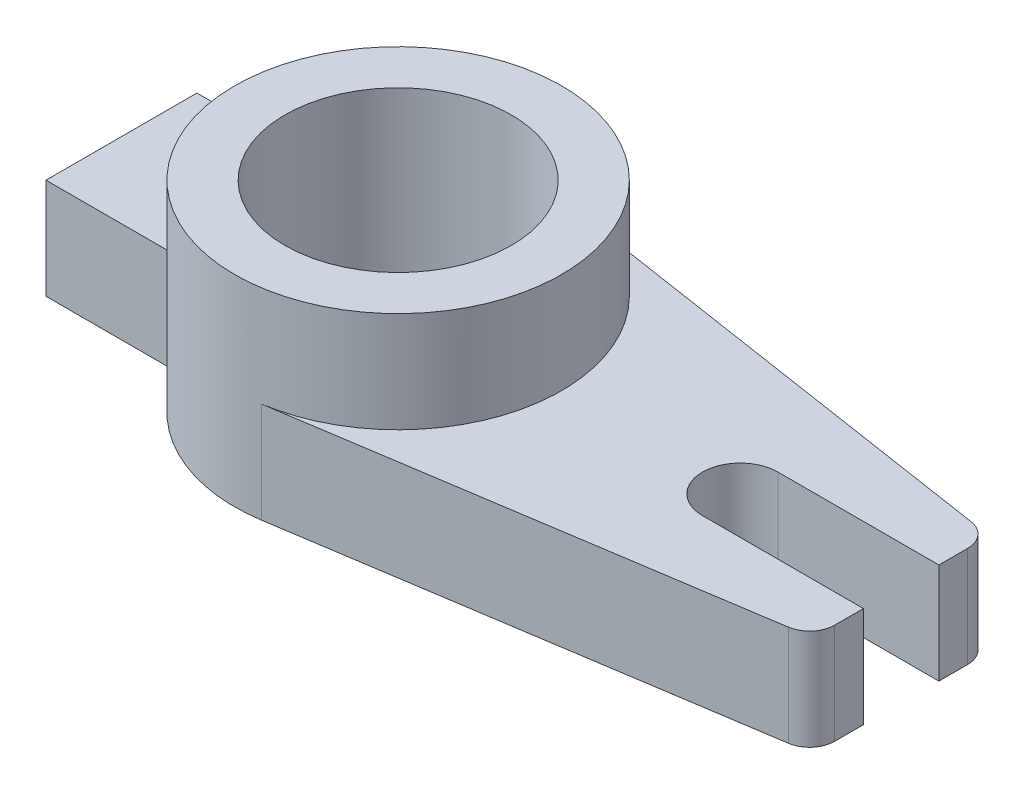
ISO-10303-21;
HEADER;
FILE_DESCRIPTION(('STEP AP214'),'2;1');
FILE_NAME('part.step','',(''),(''),'','','');
FILE_SCHEMA(('AUTOMOTIVE_DESIGN { 1 0 10303 214 1 1 1 1 }'));
ENDSEC;
DATA;
#1=APPLICATION_CONTEXT('core data for automotive mechanical design processes');
#2=APPLICATION_PROTOCOL_DEFINITION('international standard','automotive_design',2000,#1);
#3=PRODUCT_CONTEXT('',#1,'mechanical');
#4=PRODUCT('Part','Part','',(#3));
#5=PRODUCT_RELATED_PRODUCT_CATEGORY('part','',(#4));
#6=PRODUCT_DEFINITION_FORMATION('','',#4);
#7=PRODUCT_DEFINITION_CONTEXT('part definition',#1,'design');
#8=PRODUCT_DEFINITION('design','',#6,#7);
#9=PRODUCT_DEFINITION_SHAPE('','',#8);
#10=(LENGTH_UNIT() NAMED_UNIT(*) SI_UNIT(.MILLI.,.METRE.));
#11=(NAMED_UNIT(*) PLANE_ANGLE_UNIT() SI_UNIT($,.RADIAN.));
#12=(NAMED_UNIT(*) SI_UNIT($,.STERADIAN.) SOLID_ANGLE_UNIT());
#13=UNCERTAINTY_MEASURE_WITH_UNIT(LENGTH_MEASURE(1.E-05),#10,'distance_accuracy_value','');
#14=(GEOMETRIC_REPRESENTATION_CONTEXT(3) GLOBAL_UNCERTAINTY_ASSIGNED_CONTEXT((#13)) GLOBAL_UNIT_ASSIGNED_CONTEXT((#10,
#11,#12)) REPRESENTATION_CONTEXT('',''));
#15=CARTESIAN_POINT('',(0.,0.,0.));
#16=DIRECTION('',(0.,0.,1.));
#17=DIRECTION('',(1.,0.,0.));
#18=AXIS2_PLACEMENT_3D('',#15,#16,#17);
#19=CARTESIAN_POINT('',(0.,40.,0.));
#20=DIRECTION('',(0.,-1.,0.));
#21=DIRECTION('',(0.,0.,-1.));
#22=AXIS2_PLACEMENT_3D('',#19,#20,#21);
#23=CYLINDRICAL_SURFACE('',#22,32.5);
#24=CARTESIAN_POINT('',(0.,40.,0.));
#25=DIRECTION('',(0.,1.,0.));
#26=DIRECTION('',(0.,0.,1.));
#27=AXIS2_PLACEMENT_3D('',#24,#25,#26);
#28=CIRCLE('',#27,32.5);
#29=CARTESIAN_POINT('',(0.,40.,32.5));
#30=VERTEX_POINT('',#29);
#31=EDGE_CURVE('E163',#30,#30,#28,.T.);
#32=ORIENTED_EDGE('',*,*,#31,.F.);
#33=EDGE_LOOP('',(#32));
#34=FACE_BOUND('',#33,.T.);
#35=DIRECTION('',(0.,-1.,0.));
#36=VECTOR('',#35,1.);
#37=CARTESIAN_POINT('',(-28.831406486677,20.,-15.));
#38=LINE('',#37,#36);
#39=CARTESIAN_POINT('',(-28.831406486677,20.,-15.));
#40=VERTEX_POINT('',#39);
#41=CARTESIAN_POINT('',(-28.831406486677,0.,-15.));
#42=VERTEX_POINT('',#41);
#43=EDGE_CURVE('E259',#40,#42,#38,.T.);
#44=ORIENTED_EDGE('',*,*,#43,.F.);
#45=CARTESIAN_POINT('',(0.,20.,0.));
#46=DIRECTION('',(0.,1.,0.));
#47=DIRECTION('',(0.,0.,1.));
#48=AXIS2_PLACEMENT_3D('',#45,#46,#47);
#49=CIRCLE('',#48,32.5);
#50=CARTESIAN_POINT('',(-28.831406486677,20.,15.));
#51=VERTEX_POINT('',#50);
#52=EDGE_CURVE('E264',#40,#51,#49,.T.);
#53=ORIENTED_EDGE('',*,*,#52,.T.);
#54=DIRECTION('',(0.,-1.,0.));
#55=VECTOR('',#54,1.);
#56=CARTESIAN_POINT('',(-28.831406486677,20.,15.));
#57=LINE('',#56,#55);
#58=CARTESIAN_POINT('',(-28.831406486677,0.,15.));
#59=VERTEX_POINT('',#58);
#60=EDGE_CURVE('E289',#51,#59,#57,.T.);
#61=ORIENTED_EDGE('',*,*,#60,.T.);
#62=CARTESIAN_POINT('',(0.,0.,0.));
#63=DIRECTION('',(0.,1.,0.));
#64=DIRECTION('',(0.,0.,1.));
#65=AXIS2_PLACEMENT_3D('',#62,#63,#64);
#66=CIRCLE('',#65,32.5);
#67=CARTESIAN_POINT('',(4.94111598055763,0.,32.1221943968135));
#68=VERTEX_POINT('',#67);
#69=EDGE_CURVE('E276',#59,#68,#66,.T.);
#70=ORIENTED_EDGE('',*,*,#69,.T.);
#71=DIRECTION('',(0.,-1.,0.));
#72=VECTOR('',#71,1.);
#73=CARTESIAN_POINT('',(4.94111598055763,20.,32.1221943968135));
#74=LINE('',#73,#72);
#75=CARTESIAN_POINT('',(4.94111598055763,20.,32.1221943968135));
#76=VERTEX_POINT('',#75);
#77=EDGE_CURVE('E11',#76,#68,#74,.T.);
#78=ORIENTED_EDGE('',*,*,#77,.F.);
#79=CARTESIAN_POINT('',(0.,20.,0.));
#80=DIRECTION('',(0.,1.,0.));
#81=DIRECTION('',(0.,0.,1.));
#82=AXIS2_PLACEMENT_3D('',#79,#80,#81);
#83=CIRCLE('',#82,32.5);
#84=CARTESIAN_POINT('',(4.94111598055763,20.,-32.1221943968135));
#85=VERTEX_POINT('',#84);
#86=EDGE_CURVE('E182',#76,#85,#83,.T.);
#87=ORIENTED_EDGE('',*,*,#86,.T.);
#88=DIRECTION('',(0.,-1.,0.));
#89=VECTOR('',#88,1.);
#90=CARTESIAN_POINT('',(4.94111598055763,20.,-32.1221943968135));
#91=LINE('',#90,#89);
#92=CARTESIAN_POINT('',(4.94111598055763,0.,-32.1221943968135));
#93=VERTEX_POINT('',#92);
#94=EDGE_CURVE('E158',#85,#93,#91,.T.);
#95=ORIENTED_EDGE('',*,*,#94,.T.);
#96=EDGE_CURVE('E275',#93,#42,#66,.T.);
#97=ORIENTED_EDGE('',*,*,#96,.T.);
#98=EDGE_LOOP('',(#44,#53,#61,#70,#78,#87,#95,#97));
#99=FACE_BOUND('',#98,.T.);
#100=ADVANCED_FACE('F39',(#34,#99),#23,.T.);
#101=CARTESIAN_POINT('',(4.94111598055764,20.,32.1221943968135));
#102=DIRECTION('',(-0.152034337863312,0.,-0.988375212209647));
#103=DIRECTION('',(-0.988375212209647,0.,0.152034337863312));
#104=AXIS2_PLACEMENT_3D('',#101,#102,#103);
#105=PLANE('',#104);
#106=DIRECTION('',(0.988375212209647,0.,-0.152034337863312));
#107=VECTOR('',#106,1.);
#108=CARTESIAN_POINT('',(4.94111598055764,0.,32.1221943968135));
#109=LINE('',#108,#107);
#110=CARTESIAN_POINT('',(95.7601716893165,0.,18.1521809550725));
#111=VERTEX_POINT('',#110);
#112=EDGE_CURVE('E162',#68,#111,#109,.T.);
#113=ORIENTED_EDGE('',*,*,#112,.T.);
#114=DIRECTION('',(0.,-1.,0.));
#115=VECTOR('',#114,1.);
#116=CARTESIAN_POINT('',(95.7601716893165,20.,18.1521809550725));
#117=LINE('',#116,#115);
#118=CARTESIAN_POINT('',(95.7601716893165,20.,18.1521809550725));
#119=VERTEX_POINT('',#118);
#120=EDGE_CURVE('E50',#119,#111,#117,.T.);
#121=ORIENTED_EDGE('',*,*,#120,.F.);
#122=DIRECTION('',(0.988375212209647,0.,-0.152034337863312));
#123=VECTOR('',#122,1.);
#124=CARTESIAN_POINT('',(4.94111598055764,20.,32.1221943968135));
#125=LINE('',#124,#123);
#126=EDGE_CURVE('E108',#76,#119,#125,.T.);
#127=ORIENTED_EDGE('',*,*,#126,.F.);
#128=ORIENTED_EDGE('',*,*,#77,.T.);
#129=EDGE_LOOP('',(#113,#121,#127,#128));
#130=FACE_BOUND('',#129,.T.);
#131=ADVANCED_FACE('F41',(#130),#105,.F.);
#132=CARTESIAN_POINT('',(95.,20.,13.2103048940243));
#133=DIRECTION('',(0.,-1.,0.));
#134=DIRECTION('',(0.,0.,-1.));
#135=AXIS2_PLACEMENT_3D('',#132,#133,#134);
#136=CYLINDRICAL_SURFACE('',#135,5.);
#137=CARTESIAN_POINT('',(95.,0.,13.2103048940243));
#138=DIRECTION('',(0.,1.,0.));
#139=DIRECTION('',(0.,0.,1.));
#140=AXIS2_PLACEMENT_3D('',#137,#138,#139);
#141=CIRCLE('',#140,5.);
#142=CARTESIAN_POINT('',(100.,0.,13.2103048940242));
#143=VERTEX_POINT('',#142);
#144=EDGE_CURVE('E161',#143,#111,#141,.F.);
#145=ORIENTED_EDGE('',*,*,#144,.F.);
#146=DIRECTION('',(0.,-1.,0.));
#147=VECTOR('',#146,1.);
#148=CARTESIAN_POINT('',(100.,20.,13.2103048940242));
#149=LINE('',#148,#147);
#150=CARTESIAN_POINT('',(100.,20.,13.2103048940242));
#151=VERTEX_POINT('',#150);
#152=EDGE_CURVE('E191',#151,#143,#149,.T.);
#153=ORIENTED_EDGE('',*,*,#152,.F.);
#154=CARTESIAN_POINT('',(95.,20.,13.2103048940243));
#155=DIRECTION('',(0.,1.,0.));
#156=DIRECTION('',(0.,0.,1.));
#157=AXIS2_PLACEMENT_3D('',#154,#155,#156);
#158=CIRCLE('',#157,5.);
#159=EDGE_CURVE('E198',#151,#119,#158,.F.);
#160=ORIENTED_EDGE('',*,*,#159,.T.);
#161=ORIENTED_EDGE('',*,*,#120,.T.);
#162=EDGE_LOOP('',(#145,#153,#160,#161));
#163=FACE_BOUND('',#162,.T.);
#164=ADVANCED_FACE('F200',(#163),#136,.T.);
#165=CARTESIAN_POINT('',(100.,20.,0.));
#166=DIRECTION('',(1.,0.,0.));
#167=DIRECTION('',(0.,0.,-1.));
#168=AXIS2_PLACEMENT_3D('',#165,#166,#167);
#169=PLANE('',#168);
#170=DIRECTION('',(0.,0.,1.));
#171=VECTOR('',#170,1.);
#172=CARTESIAN_POINT('',(100.,0.,0.));
#173=LINE('',#172,#171);
#174=CARTESIAN_POINT('',(100.,0.,7.5));
#175=VERTEX_POINT('',#174);
#176=EDGE_CURVE('E166',#175,#143,#173,.T.);
#177=ORIENTED_EDGE('',*,*,#176,.F.);
#178=DIRECTION('',(0.,-1.,0.));
#179=VECTOR('',#178,1.);
#180=CARTESIAN_POINT('',(100.,20.,7.5));
#181=LINE('',#180,#179);
#182=CARTESIAN_POINT('',(100.,20.,7.5));
#183=VERTEX_POINT('',#182);
#184=EDGE_CURVE('E195',#183,#175,#181,.T.);
#185=ORIENTED_EDGE('',*,*,#184,.F.);
#186=DIRECTION('',(0.,0.,1.));
#187=VECTOR('',#186,1.);
#188=CARTESIAN_POINT('',(100.,20.,0.));
#189=LINE('',#188,#187);
#190=EDGE_CURVE('E211',#183,#151,#189,.T.);
#191=ORIENTED_EDGE('',*,*,#190,.T.);
#192=ORIENTED_EDGE('',*,*,#152,.T.);
#193=EDGE_LOOP('',(#177,#185,#191,#192));
#194=FACE_BOUND('',#193,.T.);
#195=ADVANCED_FACE('F208',(#194),#169,.T.);
#196=CARTESIAN_POINT('',(0.,20.,7.5));
#197=DIRECTION('',(0.,0.,-1.));
#198=DIRECTION('',(-1.,0.,0.));
#199=AXIS2_PLACEMENT_3D('',#196,#197,#198);
#200=PLANE('',#199);
#201=DIRECTION('',(1.,0.,0.));
#202=VECTOR('',#201,1.);
#203=CARTESIAN_POINT('',(0.,0.,7.5));
#204=LINE('',#203,#202);
#205=CARTESIAN_POINT('',(68.,0.,7.5));
#206=VERTEX_POINT('',#205);
#207=EDGE_CURVE('E173',#206,#175,#204,.T.);
#208=ORIENTED_EDGE('',*,*,#207,.F.);
#209=DIRECTION('',(0.,-1.,0.));
#210=VECTOR('',#209,1.);
#211=CARTESIAN_POINT('',(68.,20.,7.5));
#212=LINE('',#211,#210);
#213=CARTESIAN_POINT('',(68.,20.,7.5));
#214=VERTEX_POINT('',#213);
#215=EDGE_CURVE('E189',#214,#206,#212,.T.);
#216=ORIENTED_EDGE('',*,*,#215,.F.);
#217=DIRECTION('',(1.,0.,0.));
#218=VECTOR('',#217,1.);
#219=CARTESIAN_POINT('',(0.,20.,7.5));
#220=LINE('',#219,#218);
#221=EDGE_CURVE('E218',#214,#183,#220,.T.);
#222=ORIENTED_EDGE('',*,*,#221,.T.);
#223=ORIENTED_EDGE('',*,*,#184,.T.);
#224=EDGE_LOOP('',(#208,#216,#222,#223));
#225=FACE_BOUND('',#224,.T.);
#226=ADVANCED_FACE('F340',(#225),#200,.T.);
#227=CARTESIAN_POINT('',(68.,20.,0.));
#228=DIRECTION('',(0.,-1.,0.));
#229=DIRECTION('',(0.,0.,-1.));
#230=AXIS2_PLACEMENT_3D('',#227,#228,#229);
#231=CYLINDRICAL_SURFACE('',#230,7.50000000000001);
#232=CARTESIAN_POINT('',(68.,0.,0.));
#233=DIRECTION('',(0.,1.,0.));
#234=DIRECTION('',(0.,0.,1.));
#235=AXIS2_PLACEMENT_3D('',#232,#233,#234);
#236=CIRCLE('',#235,7.50000000000001);
#237=CARTESIAN_POINT('',(68.,0.,-7.5));
#238=VERTEX_POINT('',#237);
#239=EDGE_CURVE('E174',#238,#206,#236,.T.);
#240=ORIENTED_EDGE('',*,*,#239,.F.);
#241=DIRECTION('',(0.,-1.,0.));
#242=VECTOR('',#241,1.);
#243=CARTESIAN_POINT('',(68.,20.,-7.5));
#244=LINE('',#243,#242);
#245=CARTESIAN_POINT('',(68.,20.,-7.5));
#246=VERTEX_POINT('',#245);
#247=EDGE_CURVE('E149',#246,#238,#244,.T.);
#248=ORIENTED_EDGE('',*,*,#247,.F.);
#249=CARTESIAN_POINT('',(68.,20.,0.));
#250=DIRECTION('',(0.,1.,0.));
#251=DIRECTION('',(0.,0.,1.));
#252=AXIS2_PLACEMENT_3D('',#249,#250,#251);
#253=CIRCLE('',#252,7.50000000000001);
#254=EDGE_CURVE('E138',#246,#214,#253,.T.);
#255=ORIENTED_EDGE('',*,*,#254,.T.);
#256=ORIENTED_EDGE('',*,*,#215,.T.);
#257=EDGE_LOOP('',(#240,#248,#255,#256));
#258=FACE_BOUND('',#257,.T.);
#259=ADVANCED_FACE('F223',(#258),#231,.F.);
#260=CARTESIAN_POINT('',(0.,20.,-7.5));
#261=DIRECTION('',(0.,0.,-1.));
#262=DIRECTION('',(-1.,0.,0.));
#263=AXIS2_PLACEMENT_3D('',#260,#261,#262);
#264=PLANE('',#263);
#265=DIRECTION('',(1.,0.,0.));
#266=VECTOR('',#265,1.);
#267=CARTESIAN_POINT('',(0.,0.,-7.5));
#268=LINE('',#267,#266);
#269=CARTESIAN_POINT('',(100.,0.,-7.5));
#270=VERTEX_POINT('',#269);
#271=EDGE_CURVE('E144',#238,#270,#268,.T.);
#272=ORIENTED_EDGE('',*,*,#271,.T.);
#273=DIRECTION('',(0.,-1.,0.));
#274=VECTOR('',#273,1.);
#275=CARTESIAN_POINT('',(100.,20.,-7.5));
#276=LINE('',#275,#274);
#277=CARTESIAN_POINT('',(100.,20.,-7.5));
#278=VERTEX_POINT('',#277);
#279=EDGE_CURVE('E145',#278,#270,#276,.T.);
#280=ORIENTED_EDGE('',*,*,#279,.F.);
#281=DIRECTION('',(1.,0.,0.));
#282=VECTOR('',#281,1.);
#283=CARTESIAN_POINT('',(0.,20.,-7.5));
#284=LINE('',#283,#282);
#285=EDGE_CURVE('E127',#246,#278,#284,.T.);
#286=ORIENTED_EDGE('',*,*,#285,.F.);
#287=ORIENTED_EDGE('',*,*,#247,.T.);
#288=EDGE_LOOP('',(#272,#280,#286,#287));
#289=FACE_BOUND('',#288,.T.);
#290=ADVANCED_FACE('F142',(#289),#264,.F.);
#291=CARTESIAN_POINT('',(100.,20.,0.));
#292=DIRECTION('',(-1.,0.,0.));
#293=DIRECTION('',(0.,0.,1.));
#294=AXIS2_PLACEMENT_3D('',#291,#292,#293);
#295=PLANE('',#294);
#296=DIRECTION('',(0.,0.,-1.));
#297=VECTOR('',#296,1.);
#298=CARTESIAN_POINT('',(100.,0.,0.));
#299=LINE('',#298,#297);
#300=CARTESIAN_POINT('',(100.,0.,-13.2103048940242));
#301=VERTEX_POINT('',#300);
#302=EDGE_CURVE('E178',#270,#301,#299,.T.);
#303=ORIENTED_EDGE('',*,*,#302,.T.);
#304=DIRECTION('',(0.,-1.,0.));
#305=VECTOR('',#304,1.);
#306=CARTESIAN_POINT('',(100.,20.,-13.2103048940242));
#307=LINE('',#306,#305);
#308=CARTESIAN_POINT('',(100.,20.,-13.2103048940242));
#309=VERTEX_POINT('',#308);
#310=EDGE_CURVE('E146',#309,#301,#307,.T.);
#311=ORIENTED_EDGE('',*,*,#310,.F.);
#312=DIRECTION('',(0.,0.,-1.));
#313=VECTOR('',#312,1.);
#314=CARTESIAN_POINT('',(100.,20.,0.));
#315=LINE('',#314,#313);
#316=EDGE_CURVE('E132',#278,#309,#315,.T.);
#317=ORIENTED_EDGE('',*,*,#316,.F.);
#318=ORIENTED_EDGE('',*,*,#279,.T.);
#319=EDGE_LOOP('',(#303,#311,#317,#318));
#320=FACE_BOUND('',#319,.T.);
#321=ADVANCED_FACE('F152',(#320),#295,.F.);
#322=CARTESIAN_POINT('',(95.,20.,-13.2103048940243));
#323=DIRECTION('',(0.,-1.,0.));
#324=DIRECTION('',(0.,0.,-1.));
#325=AXIS2_PLACEMENT_3D('',#322,#323,#324);
#326=CYLINDRICAL_SURFACE('',#325,5.);
#327=CARTESIAN_POINT('',(95.,0.,-13.2103048940243));
#328=DIRECTION('',(0.,1.,0.));
#329=DIRECTION('',(0.,0.,1.));
#330=AXIS2_PLACEMENT_3D('',#327,#328,#329);
#331=CIRCLE('',#330,5.);
#332=CARTESIAN_POINT('',(95.7601716893165,0.,-18.1521809550725));
#333=VERTEX_POINT('',#332);
#334=EDGE_CURVE('E179',#301,#333,#331,.T.);
#335=ORIENTED_EDGE('',*,*,#334,.T.);
#336=DIRECTION('',(0.,-1.,0.));
#337=VECTOR('',#336,1.);
#338=CARTESIAN_POINT('',(95.7601716893165,20.,-18.1521809550725));
#339=LINE('',#338,#337);
#340=CARTESIAN_POINT('',(95.7601716893165,20.,-18.1521809550725));
#341=VERTEX_POINT('',#340);
#342=EDGE_CURVE('E186',#341,#333,#339,.T.);
#343=ORIENTED_EDGE('',*,*,#342,.F.);
#344=CARTESIAN_POINT('',(95.,20.,-13.2103048940243));
#345=DIRECTION('',(0.,1.,0.));
#346=DIRECTION('',(0.,0.,1.));
#347=AXIS2_PLACEMENT_3D('',#344,#345,#346);
#348=CIRCLE('',#347,5.);
#349=EDGE_CURVE('E65',#309,#341,#348,.T.);
#350=ORIENTED_EDGE('',*,*,#349,.F.);
#351=ORIENTED_EDGE('',*,*,#310,.T.);
#352=EDGE_LOOP('',(#335,#343,#350,#351));
#353=FACE_BOUND('',#352,.T.);
#354=ADVANCED_FACE('F226',(#353),#326,.T.);
#355=CARTESIAN_POINT('',(4.94111598055764,20.,-32.1221943968135));
#356=DIRECTION('',(0.152034337863312,0.,-0.988375212209647));
#357=DIRECTION('',(-0.988375212209647,0.,-0.152034337863312));
#358=AXIS2_PLACEMENT_3D('',#355,#356,#357);
#359=PLANE('',#358);
#360=DIRECTION('',(0.988375212209647,0.,0.152034337863312));
#361=VECTOR('',#360,1.);
#362=CARTESIAN_POINT('',(4.94111598055764,0.,-32.1221943968135));
#363=LINE('',#362,#361);
#364=EDGE_CURVE('E105',#93,#333,#363,.T.);
#365=ORIENTED_EDGE('',*,*,#364,.F.);
#366=ORIENTED_EDGE('',*,*,#94,.F.);
#367=DIRECTION('',(0.988375212209647,0.,0.152034337863312));
#368=VECTOR('',#367,1.);
#369=CARTESIAN_POINT('',(4.94111598055764,20.,-32.1221943968135));
#370=LINE('',#369,#368);
#371=EDGE_CURVE('E151',#85,#341,#370,.T.);
#372=ORIENTED_EDGE('',*,*,#371,.T.);
#373=ORIENTED_EDGE('',*,*,#342,.T.);
#374=EDGE_LOOP('',(#365,#366,#372,#373));
#375=FACE_BOUND('',#374,.T.);
#376=ADVANCED_FACE('F230',(#375),#359,.T.);
#377=CARTESIAN_POINT('',(0.,20.,0.));
#378=DIRECTION('',(0.,1.,0.));
#379=DIRECTION('',(0.,0.,1.));
#380=AXIS2_PLACEMENT_3D('',#377,#378,#379);
#381=PLANE('',#380);
#382=ORIENTED_EDGE('',*,*,#86,.F.);
#383=ORIENTED_EDGE('',*,*,#126,.T.);
#384=ORIENTED_EDGE('',*,*,#159,.F.);
#385=ORIENTED_EDGE('',*,*,#190,.F.);
#386=ORIENTED_EDGE('',*,*,#221,.F.);
#387=ORIENTED_EDGE('',*,*,#254,.F.);
#388=ORIENTED_EDGE('',*,*,#285,.T.);
#389=ORIENTED_EDGE('',*,*,#316,.T.);
#390=ORIENTED_EDGE('',*,*,#349,.T.);
#391=ORIENTED_EDGE('',*,*,#371,.F.);
#392=EDGE_LOOP('',(#382,#383,#384,#385,#386,#387,#388,#389,#390,#391));
#393=FACE_BOUND('',#392,.T.);
#394=ADVANCED_FACE('F135',(#393),#381,.T.);
#395=CARTESIAN_POINT('',(0.,0.,0.));
#396=DIRECTION('',(0.,1.,0.));
#397=DIRECTION('',(0.,0.,1.));
#398=AXIS2_PLACEMENT_3D('',#395,#396,#397);
#399=PLANE('',#398);
#400=ORIENTED_EDGE('',*,*,#112,.F.);
#401=ORIENTED_EDGE('',*,*,#69,.F.);
#402=DIRECTION('',(-1.,0.,0.));
#403=VECTOR('',#402,1.);
#404=CARTESIAN_POINT('',(0.,0.,15.));
#405=LINE('',#404,#403);
#406=CARTESIAN_POINT('',(-55.,0.,15.));
#407=VERTEX_POINT('',#406);
#408=EDGE_CURVE('E254',#59,#407,#405,.T.);
#409=ORIENTED_EDGE('',*,*,#408,.T.);
#410=DIRECTION('',(0.,0.,1.));
#411=VECTOR('',#410,1.);
#412=CARTESIAN_POINT('',(-55.,0.,0.));
#413=LINE('',#412,#411);
#414=CARTESIAN_POINT('',(-55.,0.,-15.));
#415=VERTEX_POINT('',#414);
#416=EDGE_CURVE('E288',#415,#407,#413,.T.);
#417=ORIENTED_EDGE('',*,*,#416,.F.);
#418=DIRECTION('',(-1.,0.,0.));
#419=VECTOR('',#418,1.);
#420=CARTESIAN_POINT('',(0.,0.,-15.));
#421=LINE('',#420,#419);
#422=EDGE_CURVE('E295',#42,#415,#421,.T.);
#423=ORIENTED_EDGE('',*,*,#422,.F.);
#424=ORIENTED_EDGE('',*,*,#96,.F.);
#425=ORIENTED_EDGE('',*,*,#364,.T.);
#426=ORIENTED_EDGE('',*,*,#334,.F.);
#427=ORIENTED_EDGE('',*,*,#302,.F.);
#428=ORIENTED_EDGE('',*,*,#271,.F.);
#429=ORIENTED_EDGE('',*,*,#239,.T.);
#430=ORIENTED_EDGE('',*,*,#207,.T.);
#431=ORIENTED_EDGE('',*,*,#176,.T.);
#432=ORIENTED_EDGE('',*,*,#144,.T.);
#433=EDGE_LOOP('',(#400,#401,#409,#417,#423,#424,#425,#426,#427,#428,#429,#430,#431,#432));
#434=FACE_BOUND('',#433,.T.);
#435=CARTESIAN_POINT('',(0.,0.,0.));
#436=DIRECTION('',(0.,1.,0.));
#437=DIRECTION('',(0.,0.,1.));
#438=AXIS2_PLACEMENT_3D('',#435,#436,#437);
#439=CIRCLE('',#438,22.5);
#440=CARTESIAN_POINT('',(0.,0.,22.5));
#441=VERTEX_POINT('',#440);
#442=EDGE_CURVE('E273',#441,#441,#439,.T.);
#443=ORIENTED_EDGE('',*,*,#442,.T.);
#444=EDGE_LOOP('',(#443));
#445=FACE_BOUND('',#444,.T.);
#446=ADVANCED_FACE('F203',(#434,#445),#399,.F.);
#447=CARTESIAN_POINT('',(0.,40.,0.));
#448=DIRECTION('',(0.,-1.,0.));
#449=DIRECTION('',(0.,0.,-1.));
#450=AXIS2_PLACEMENT_3D('',#447,#448,#449);
#451=CYLINDRICAL_SURFACE('',#450,22.5);
#452=CARTESIAN_POINT('',(0.,40.,0.));
#453=DIRECTION('',(0.,1.,0.));
#454=DIRECTION('',(0.,0.,1.));
#455=AXIS2_PLACEMENT_3D('',#452,#453,#454);
#456=CIRCLE('',#455,22.5);
#457=CARTESIAN_POINT('',(0.,40.,22.5));
#458=VERTEX_POINT('',#457);
#459=EDGE_CURVE('E285',#458,#458,#456,.T.);
#460=ORIENTED_EDGE('',*,*,#459,.T.);
#461=EDGE_LOOP('',(#460));
#462=FACE_BOUND('',#461,.T.);
#463=ORIENTED_EDGE('',*,*,#442,.F.);
#464=EDGE_LOOP('',(#463));
#465=FACE_BOUND('',#464,.T.);
#466=ADVANCED_FACE('F319',(#462,#465),#451,.F.);
#467=CARTESIAN_POINT('',(0.,40.,0.));
#468=DIRECTION('',(0.,1.,0.));
#469=DIRECTION('',(0.,0.,1.));
#470=AXIS2_PLACEMENT_3D('',#467,#468,#469);
#471=PLANE('',#470);
#472=ORIENTED_EDGE('',*,*,#459,.F.);
#473=EDGE_LOOP('',(#472));
#474=FACE_BOUND('',#473,.T.);
#475=ORIENTED_EDGE('',*,*,#31,.T.);
#476=EDGE_LOOP('',(#475));
#477=FACE_BOUND('',#476,.T.);
#478=ADVANCED_FACE('F306',(#474,#477),#471,.T.);
#479=CARTESIAN_POINT('',(0.,20.,-15.));
#480=DIRECTION('',(0.,0.,1.));
#481=DIRECTION('',(1.,0.,0.));
#482=AXIS2_PLACEMENT_3D('',#479,#480,#481);
#483=PLANE('',#482);
#484=ORIENTED_EDGE('',*,*,#422,.T.);
#485=DIRECTION('',(0.,-1.,0.));
#486=VECTOR('',#485,1.);
#487=CARTESIAN_POINT('',(-55.,20.,-15.));
#488=LINE('',#487,#486);
#489=CARTESIAN_POINT('',(-55.,20.,-15.));
#490=VERTEX_POINT('',#489);
#491=EDGE_CURVE('E261',#490,#415,#488,.T.);
#492=ORIENTED_EDGE('',*,*,#491,.F.);
#493=DIRECTION('',(-1.,0.,0.));
#494=VECTOR('',#493,1.);
#495=CARTESIAN_POINT('',(0.,20.,-15.));
#496=LINE('',#495,#494);
#497=EDGE_CURVE('E257',#40,#490,#496,.T.);
#498=ORIENTED_EDGE('',*,*,#497,.F.);
#499=ORIENTED_EDGE('',*,*,#43,.T.);
#500=EDGE_LOOP('',(#484,#492,#498,#499));
#501=FACE_BOUND('',#500,.T.);
#502=ADVANCED_FACE('F256',(#501),#483,.F.);
#503=CARTESIAN_POINT('',(-55.,20.,0.));
#504=DIRECTION('',(1.,0.,0.));
#505=DIRECTION('',(0.,0.,-1.));
#506=AXIS2_PLACEMENT_3D('',#503,#504,#505);
#507=PLANE('',#506);
#508=ORIENTED_EDGE('',*,*,#416,.T.);
#509=DIRECTION('',(0.,-1.,0.));
#510=VECTOR('',#509,1.);
#511=CARTESIAN_POINT('',(-55.,20.,15.));
#512=LINE('',#511,#510);
#513=CARTESIAN_POINT('',(-55.,20.,15.));
#514=VERTEX_POINT('',#513);
#515=EDGE_CURVE('E277',#514,#407,#512,.T.);
#516=ORIENTED_EDGE('',*,*,#515,.F.);
#517=DIRECTION('',(0.,0.,1.));
#518=VECTOR('',#517,1.);
#519=CARTESIAN_POINT('',(-55.,20.,0.));
#520=LINE('',#519,#518);
#521=EDGE_CURVE('E233',#490,#514,#520,.T.);
#522=ORIENTED_EDGE('',*,*,#521,.F.);
#523=ORIENTED_EDGE('',*,*,#491,.T.);
#524=EDGE_LOOP('',(#508,#516,#522,#523));
#525=FACE_BOUND('',#524,.T.);
#526=ADVANCED_FACE('F300',(#525),#507,.F.);
#527=CARTESIAN_POINT('',(0.,20.,15.));
#528=DIRECTION('',(0.,0.,1.));
#529=DIRECTION('',(1.,0.,0.));
#530=AXIS2_PLACEMENT_3D('',#527,#528,#529);
#531=PLANE('',#530);
#532=ORIENTED_EDGE('',*,*,#408,.F.);
#533=ORIENTED_EDGE('',*,*,#60,.F.);
#534=DIRECTION('',(-1.,0.,0.));
#535=VECTOR('',#534,1.);
#536=CARTESIAN_POINT('',(0.,20.,15.));
#537=LINE('',#536,#535);
#538=EDGE_CURVE('E53',#51,#514,#537,.T.);
#539=ORIENTED_EDGE('',*,*,#538,.T.);
#540=ORIENTED_EDGE('',*,*,#515,.T.);
#541=EDGE_LOOP('',(#532,#533,#539,#540));
#542=FACE_BOUND('',#541,.T.);
#543=ADVANCED_FACE('F297',(#542),#531,.T.);
#544=CARTESIAN_POINT('',(0.,20.,0.));
#545=DIRECTION('',(0.,1.,0.));
#546=DIRECTION('',(0.,0.,1.));
#547=AXIS2_PLACEMENT_3D('',#544,#545,#546);
#548=PLANE('',#547);
#549=ORIENTED_EDGE('',*,*,#52,.F.);
#550=ORIENTED_EDGE('',*,*,#497,.T.);
#551=ORIENTED_EDGE('',*,*,#521,.T.);
#552=ORIENTED_EDGE('',*,*,#538,.F.);
#553=EDGE_LOOP('',(#549,#550,#551,#552));
#554=FACE_BOUND('',#553,.T.);
#555=ADVANCED_FACE('F270',(#554),#548,.T.);
#556=CLOSED_SHELL('',(#100,#131,#164,#195,#226,#259,#290,#321,#354,#376,#394,#446,#466,#478,
#502,#526,#543,#555));
#557=MANIFOLD_SOLID_BREP('B2',#556);
#558=ADVANCED_BREP_SHAPE_REPRESENTATION('',(#18,#557),#14);
#559=SHAPE_DEFINITION_REPRESENTATION(#9,#558);
ENDSEC;
END-ISO-10303-21;
